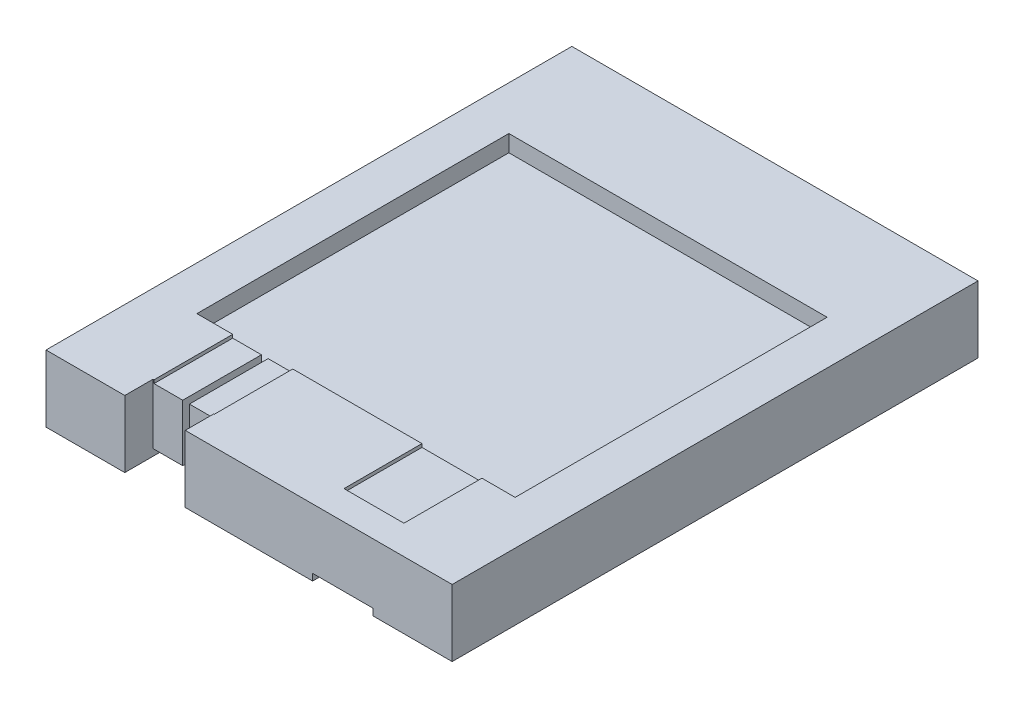
ISO-10303-21;
HEADER;
FILE_DESCRIPTION(('STEP AP214'),'2;1');
FILE_NAME('part.step','',(''),(''),'','','');
FILE_SCHEMA(('AUTOMOTIVE_DESIGN { 1 0 10303 214 1 1 1 1 }'));
ENDSEC;
DATA;
#1=APPLICATION_CONTEXT('core data for automotive mechanical design processes');
#2=APPLICATION_PROTOCOL_DEFINITION('international standard','automotive_design',2000,#1);
#3=PRODUCT_CONTEXT('',#1,'mechanical');
#4=PRODUCT('Part','Part','',(#3));
#5=PRODUCT_RELATED_PRODUCT_CATEGORY('part','',(#4));
#6=PRODUCT_DEFINITION_FORMATION('','',#4);
#7=PRODUCT_DEFINITION_CONTEXT('part definition',#1,'design');
#8=PRODUCT_DEFINITION('design','',#6,#7);
#9=PRODUCT_DEFINITION_SHAPE('','',#8);
#10=(LENGTH_UNIT() NAMED_UNIT(*) SI_UNIT(.MILLI.,.METRE.));
#11=(NAMED_UNIT(*) PLANE_ANGLE_UNIT() SI_UNIT($,.RADIAN.));
#12=(NAMED_UNIT(*) SI_UNIT($,.STERADIAN.) SOLID_ANGLE_UNIT());
#13=UNCERTAINTY_MEASURE_WITH_UNIT(LENGTH_MEASURE(1.E-05),#10,'distance_accuracy_value','');
#14=(GEOMETRIC_REPRESENTATION_CONTEXT(3) GLOBAL_UNCERTAINTY_ASSIGNED_CONTEXT((#13)) GLOBAL_UNIT_ASSIGNED_CONTEXT((#10,
#11,#12)) REPRESENTATION_CONTEXT('',''));
#15=CARTESIAN_POINT('',(0.,0.,0.));
#16=DIRECTION('',(0.,0.,1.));
#17=DIRECTION('',(1.,0.,0.));
#18=AXIS2_PLACEMENT_3D('',#15,#16,#17);
#19=CARTESIAN_POINT('',(0.,2.,0.));
#20=DIRECTION('',(0.,-1.,0.));
#21=DIRECTION('',(0.,0.,-1.));
#22=AXIS2_PLACEMENT_3D('',#19,#20,#21);
#23=PLANE('',#22);
#24=DIRECTION('',(0.,0.,1.));
#25=VECTOR('',#24,1.);
#26=CARTESIAN_POINT('',(-19.1136299810802,2.,78.7194338461538));
#27=LINE('',#26,#25);
#28=CARTESIAN_POINT('',(-19.1136299810801,2.,-78.7194338461538));
#29=VERTEX_POINT('',#28);
#30=CARTESIAN_POINT('',(-19.1136299810802,2.,70.266699865865));
#31=VERTEX_POINT('',#30);
#32=EDGE_CURVE('E374',#29,#31,#27,.T.);
#33=ORIENTED_EDGE('',*,*,#32,.T.);
#34=DIRECTION('',(-1.,0.,0.));
#35=VECTOR('',#34,1.);
#36=CARTESIAN_POINT('',(-19.1136299810802,2.,70.266699865865));
#37=LINE('',#36,#35);
#38=CARTESIAN_POINT('',(-26.3136299810801,2.,70.266699865865));
#39=VERTEX_POINT('',#38);
#40=EDGE_CURVE('E500',#31,#39,#37,.T.);
#41=ORIENTED_EDGE('',*,*,#40,.T.);
#42=DIRECTION('',(0.,0.,-1.));
#43=VECTOR('',#42,1.);
#44=CARTESIAN_POINT('',(-26.3136299810801,2.,0.));
#45=LINE('',#44,#43);
#46=CARTESIAN_POINT('',(-26.3136299810801,2.,46.7028180249685));
#47=VERTEX_POINT('',#46);
#48=EDGE_CURVE('E311',#39,#47,#45,.T.);
#49=ORIENTED_EDGE('',*,*,#48,.T.);
#50=DIRECTION('',(1.,0.,0.));
#51=VECTOR('',#50,1.);
#52=CARTESIAN_POINT('',(-28.3136299810801,2.,46.7028180249685));
#53=LINE('',#52,#51);
#54=CARTESIAN_POINT('',(-28.3136299810801,2.,46.7028180249685));
#55=VERTEX_POINT('',#54);
#56=EDGE_CURVE('E317',#55,#47,#53,.T.);
#57=ORIENTED_EDGE('',*,*,#56,.F.);
#58=DIRECTION('',(0.,0.,1.));
#59=VECTOR('',#58,1.);
#60=CARTESIAN_POINT('',(-28.3136299810801,2.,0.));
#61=LINE('',#60,#59);
#62=CARTESIAN_POINT('',(-28.3136299810801,2.,70.266699865865));
#63=VERTEX_POINT('',#62);
#64=EDGE_CURVE('E41',#55,#63,#61,.T.);
#65=ORIENTED_EDGE('',*,*,#64,.T.);
#66=CARTESIAN_POINT('',(-37.2136299810801,2.,70.266699865865));
#67=VERTEX_POINT('',#66);
#68=EDGE_CURVE('E48',#63,#67,#37,.T.);
#69=ORIENTED_EDGE('',*,*,#68,.T.);
#70=DIRECTION('',(0.,0.,-1.));
#71=VECTOR('',#70,1.);
#72=CARTESIAN_POINT('',(-37.2136299810801,2.,78.7194338461538));
#73=LINE('',#72,#71);
#74=CARTESIAN_POINT('',(-37.2136299810801,2.,-78.7194338461538));
#75=VERTEX_POINT('',#74);
#76=EDGE_CURVE('E369',#67,#75,#73,.T.);
#77=ORIENTED_EDGE('',*,*,#76,.T.);
#78=DIRECTION('',(1.,0.,0.));
#79=VECTOR('',#78,1.);
#80=CARTESIAN_POINT('',(-37.2136299810801,2.,-78.7194338461538));
#81=LINE('',#80,#79);
#82=EDGE_CURVE('E371',#75,#29,#81,.T.);
#83=ORIENTED_EDGE('',*,*,#82,.T.);
#84=EDGE_LOOP('',(#33,#41,#49,#57,#65,#69,#77,#83));
#85=FACE_BOUND('',#84,.T.);
#86=ADVANCED_FACE('F33',(#85),#23,.T.);
#87=CARTESIAN_POINT('',(-28.3136299810801,2.,79.7028180249685));
#88=DIRECTION('',(1.,0.,0.));
#89=DIRECTION('',(0.,0.,-1.));
#90=AXIS2_PLACEMENT_3D('',#87,#88,#89);
#91=PLANE('',#90);
#92=DIRECTION('',(0.,0.,-1.));
#93=VECTOR('',#92,1.);
#94=CARTESIAN_POINT('',(-28.3136299810801,19.,0.));
#95=LINE('',#94,#93);
#96=CARTESIAN_POINT('',(-28.3136299810801,19.,70.266699865865));
#97=VERTEX_POINT('',#96);
#98=CARTESIAN_POINT('',(-28.3136299810801,19.,46.7028180249685));
#99=VERTEX_POINT('',#98);
#100=EDGE_CURVE('E324',#97,#99,#95,.T.);
#101=ORIENTED_EDGE('',*,*,#100,.F.);
#102=DIRECTION('',(0.,-1.,0.));
#103=VECTOR('',#102,1.);
#104=CARTESIAN_POINT('',(-28.3136299810801,2.,70.266699865865));
#105=LINE('',#104,#103);
#106=EDGE_CURVE('E322',#97,#63,#105,.T.);
#107=ORIENTED_EDGE('',*,*,#106,.T.);
#108=ORIENTED_EDGE('',*,*,#64,.F.);
#109=DIRECTION('',(0.,-1.,0.));
#110=VECTOR('',#109,1.);
#111=CARTESIAN_POINT('',(-28.3136299810801,2.,46.7028180249685));
#112=LINE('',#111,#110);
#113=CARTESIAN_POINT('',(-28.3136299810801,15.,46.7028180249685));
#114=VERTEX_POINT('',#113);
#115=EDGE_CURVE('E56',#114,#55,#112,.T.);
#116=ORIENTED_EDGE('',*,*,#115,.F.);
#117=EDGE_CURVE('E328',#99,#114,#112,.T.);
#118=ORIENTED_EDGE('',*,*,#117,.F.);
#119=EDGE_LOOP('',(#101,#107,#108,#116,#118));
#120=FACE_BOUND('',#119,.T.);
#121=ADVANCED_FACE('F320',(#120),#91,.T.);
#122=CARTESIAN_POINT('',(-26.3136299810801,2.,79.7028180249685));
#123=DIRECTION('',(-1.,0.,0.));
#124=DIRECTION('',(0.,0.,1.));
#125=AXIS2_PLACEMENT_3D('',#122,#123,#124);
#126=PLANE('',#125);
#127=ORIENTED_EDGE('',*,*,#48,.F.);
#128=DIRECTION('',(0.,1.,0.));
#129=VECTOR('',#128,1.);
#130=CARTESIAN_POINT('',(-26.3136299810801,2.,70.266699865865));
#131=LINE('',#130,#129);
#132=CARTESIAN_POINT('',(-26.3136299810801,19.,70.266699865865));
#133=VERTEX_POINT('',#132);
#134=EDGE_CURVE('E11',#39,#133,#131,.T.);
#135=ORIENTED_EDGE('',*,*,#134,.T.);
#136=DIRECTION('',(0.,0.,1.));
#137=VECTOR('',#136,1.);
#138=CARTESIAN_POINT('',(-26.3136299810801,19.,0.));
#139=LINE('',#138,#137);
#140=CARTESIAN_POINT('',(-26.3136299810801,19.,46.7028180249685));
#141=VERTEX_POINT('',#140);
#142=EDGE_CURVE('E341',#141,#133,#139,.T.);
#143=ORIENTED_EDGE('',*,*,#142,.F.);
#144=DIRECTION('',(0.,1.,0.));
#145=VECTOR('',#144,1.);
#146=CARTESIAN_POINT('',(-26.3136299810801,2.,46.7028180249685));
#147=LINE('',#146,#145);
#148=CARTESIAN_POINT('',(-26.3136299810801,15.,46.7028180249685));
#149=VERTEX_POINT('',#148);
#150=EDGE_CURVE('E335',#149,#141,#147,.T.);
#151=ORIENTED_EDGE('',*,*,#150,.F.);
#152=EDGE_CURVE('E336',#47,#149,#147,.T.);
#153=ORIENTED_EDGE('',*,*,#152,.F.);
#154=EDGE_LOOP('',(#127,#135,#143,#151,#153));
#155=FACE_BOUND('',#154,.T.);
#156=ADVANCED_FACE('F533',(#155),#126,.T.);
#157=CARTESIAN_POINT('',(-60.8019507692308,20.,78.7194338461538));
#158=DIRECTION('',(0.,0.,-1.));
#159=DIRECTION('',(-1.,0.,0.));
#160=AXIS2_PLACEMENT_3D('',#157,#158,#159);
#161=PLANE('',#160);
#162=DIRECTION('',(0.,-1.,0.));
#163=VECTOR('',#162,1.);
#164=CARTESIAN_POINT('',(-37.2136299810801,2.,78.7194338461538));
#165=LINE('',#164,#163);
#166=CARTESIAN_POINT('',(-37.2136299810801,20.,78.7194338461538));
#167=VERTEX_POINT('',#166);
#168=CARTESIAN_POINT('',(-37.2136299810801,0.,78.7194338461538));
#169=VERTEX_POINT('',#168);
#170=EDGE_CURVE('E251',#167,#169,#165,.T.);
#171=ORIENTED_EDGE('',*,*,#170,.F.);
#172=DIRECTION('',(1.,0.,0.));
#173=VECTOR('',#172,1.);
#174=CARTESIAN_POINT('',(-60.8019507692308,20.,78.7194338461538));
#175=LINE('',#174,#173);
#176=CARTESIAN_POINT('',(-60.8019507692308,20.,78.7194338461538));
#177=VERTEX_POINT('',#176);
#178=EDGE_CURVE('E268',#177,#167,#175,.T.);
#179=ORIENTED_EDGE('',*,*,#178,.F.);
#180=DIRECTION('',(0.,-1.,0.));
#181=VECTOR('',#180,1.);
#182=CARTESIAN_POINT('',(-60.8019507692308,20.,78.7194338461538));
#183=LINE('',#182,#181);
#184=CARTESIAN_POINT('',(-60.8019507692308,0.,78.7194338461538));
#185=VERTEX_POINT('',#184);
#186=EDGE_CURVE('E293',#177,#185,#183,.T.);
#187=ORIENTED_EDGE('',*,*,#186,.T.);
#188=DIRECTION('',(1.,0.,0.));
#189=VECTOR('',#188,1.);
#190=CARTESIAN_POINT('',(-60.8019507692308,0.,78.7194338461538));
#191=LINE('',#190,#189);
#192=EDGE_CURVE('E287',#185,#169,#191,.T.);
#193=ORIENTED_EDGE('',*,*,#192,.T.);
#194=EDGE_LOOP('',(#171,#179,#187,#193));
#195=FACE_BOUND('',#194,.T.);
#196=ADVANCED_FACE('F488',(#195),#161,.F.);
#197=CARTESIAN_POINT('',(-19.1136299810802,20.,78.7194338461538));
#198=VERTEX_POINT('',#197);
#199=CARTESIAN_POINT('',(60.8019507692308,20.,78.7194338461538));
#200=VERTEX_POINT('',#199);
#201=EDGE_CURVE('E258',#198,#200,#175,.T.);
#202=ORIENTED_EDGE('',*,*,#201,.F.);
#203=DIRECTION('',(0.,-1.,0.));
#204=VECTOR('',#203,1.);
#205=CARTESIAN_POINT('',(-19.1136299810802,2.,78.7194338461538));
#206=LINE('',#205,#204);
#207=CARTESIAN_POINT('',(-19.1136299810802,0.,78.7194338461538));
#208=VERTEX_POINT('',#207);
#209=EDGE_CURVE('E239',#198,#208,#206,.T.);
#210=ORIENTED_EDGE('',*,*,#209,.T.);
#211=CARTESIAN_POINT('',(19.030400305009,0.,78.7194338461538));
#212=VERTEX_POINT('',#211);
#213=EDGE_CURVE('E291',#208,#212,#191,.T.);
#214=ORIENTED_EDGE('',*,*,#213,.T.);
#215=DIRECTION('',(0.,1.,0.));
#216=VECTOR('',#215,1.);
#217=CARTESIAN_POINT('',(19.030400305009,20.,78.7194338461538));
#218=LINE('',#217,#216);
#219=CARTESIAN_POINT('',(19.030400305009,2.,78.7194338461538));
#220=VERTEX_POINT('',#219);
#221=EDGE_CURVE('E365',#212,#220,#218,.T.);
#222=ORIENTED_EDGE('',*,*,#221,.T.);
#223=DIRECTION('',(-1.,0.,0.));
#224=VECTOR('',#223,1.);
#225=CARTESIAN_POINT('',(-60.8019507692308,2.,78.7194338461538));
#226=LINE('',#225,#224);
#227=CARTESIAN_POINT('',(37.130400305009,2.,78.7194338461538));
#228=VERTEX_POINT('',#227);
#229=EDGE_CURVE('E309',#228,#220,#226,.T.);
#230=ORIENTED_EDGE('',*,*,#229,.F.);
#231=DIRECTION('',(0.,-1.,0.));
#232=VECTOR('',#231,1.);
#233=CARTESIAN_POINT('',(37.130400305009,20.,78.7194338461538));
#234=LINE('',#233,#232);
#235=CARTESIAN_POINT('',(37.130400305009,0.,78.7194338461538));
#236=VERTEX_POINT('',#235);
#237=EDGE_CURVE('E361',#228,#236,#234,.T.);
#238=ORIENTED_EDGE('',*,*,#237,.T.);
#239=CARTESIAN_POINT('',(60.8019507692308,0.,78.7194338461538));
#240=VERTEX_POINT('',#239);
#241=EDGE_CURVE('E286',#236,#240,#191,.T.);
#242=ORIENTED_EDGE('',*,*,#241,.T.);
#243=DIRECTION('',(0.,-1.,0.));
#244=VECTOR('',#243,1.);
#245=CARTESIAN_POINT('',(60.8019507692308,20.,78.7194338461538));
#246=LINE('',#245,#244);
#247=EDGE_CURVE('E266',#200,#240,#246,.T.);
#248=ORIENTED_EDGE('',*,*,#247,.F.);
#249=EDGE_LOOP('',(#202,#210,#214,#222,#230,#238,#242,#248));
#250=FACE_BOUND('',#249,.T.);
#251=ADVANCED_FACE('F264',(#250),#161,.F.);
#252=CARTESIAN_POINT('',(0.,20.,0.));
#253=DIRECTION('',(0.,-1.,0.));
#254=DIRECTION('',(0.,0.,-1.));
#255=AXIS2_PLACEMENT_3D('',#252,#253,#254);
#256=PLANE('',#255);
#257=DIRECTION('',(1.,0.,0.));
#258=VECTOR('',#257,1.);
#259=CARTESIAN_POINT('',(-18.9363839661472,20.,70.266699865865));
#260=LINE('',#259,#258);
#261=CARTESIAN_POINT('',(-19.1136299810802,20.,70.266699865865));
#262=VERTEX_POINT('',#261);
#263=CARTESIAN_POINT('',(-18.9363839661472,20.,70.266699865865));
#264=VERTEX_POINT('',#263);
#265=EDGE_CURVE('E261',#262,#264,#260,.T.);
#266=ORIENTED_EDGE('',*,*,#265,.F.);
#267=DIRECTION('',(0.,0.,1.));
#268=VECTOR('',#267,1.);
#269=CARTESIAN_POINT('',(-19.1136299810802,20.,44.7400471279912));
#270=LINE('',#269,#268);
#271=EDGE_CURVE('E243',#262,#198,#270,.T.);
#272=ORIENTED_EDGE('',*,*,#271,.T.);
#273=ORIENTED_EDGE('',*,*,#201,.T.);
#274=DIRECTION('',(0.,0.,-1.));
#275=VECTOR('',#274,1.);
#276=CARTESIAN_POINT('',(60.8019507692308,20.,78.7194338461538));
#277=LINE('',#276,#275);
#278=CARTESIAN_POINT('',(60.8019507692308,20.,-78.7194338461538));
#279=VERTEX_POINT('',#278);
#280=EDGE_CURVE('E290',#200,#279,#277,.T.);
#281=ORIENTED_EDGE('',*,*,#280,.T.);
#282=DIRECTION('',(-1.,0.,0.));
#283=VECTOR('',#282,1.);
#284=CARTESIAN_POINT('',(-60.8019507692308,20.,-78.7194338461538));
#285=LINE('',#284,#283);
#286=CARTESIAN_POINT('',(-60.8019507692308,20.,-78.7194338461538));
#287=VERTEX_POINT('',#286);
#288=EDGE_CURVE('E272',#279,#287,#285,.T.);
#289=ORIENTED_EDGE('',*,*,#288,.T.);
#290=DIRECTION('',(0.,0.,1.));
#291=VECTOR('',#290,1.);
#292=CARTESIAN_POINT('',(-60.8019507692308,20.,78.7194338461538));
#293=LINE('',#292,#291);
#294=EDGE_CURVE('E269',#287,#177,#293,.T.);
#295=ORIENTED_EDGE('',*,*,#294,.T.);
#296=ORIENTED_EDGE('',*,*,#178,.T.);
#297=DIRECTION('',(0.,0.,1.));
#298=VECTOR('',#297,1.);
#299=CARTESIAN_POINT('',(-37.2136299810801,20.,44.7400471279912));
#300=LINE('',#299,#298);
#301=CARTESIAN_POINT('',(-37.2136299810801,20.,70.266699865865));
#302=VERTEX_POINT('',#301);
#303=EDGE_CURVE('E262',#302,#167,#300,.T.);
#304=ORIENTED_EDGE('',*,*,#303,.F.);
#305=DIRECTION('',(1.,0.,0.));
#306=VECTOR('',#305,1.);
#307=CARTESIAN_POINT('',(-19.1136299810802,20.,70.266699865865));
#308=LINE('',#307,#306);
#309=CARTESIAN_POINT('',(-36.9121512462795,20.,70.266699865865));
#310=VERTEX_POINT('',#309);
#311=EDGE_CURVE('E326',#302,#310,#308,.T.);
#312=ORIENTED_EDGE('',*,*,#311,.T.);
#313=DIRECTION('',(0.,0.,1.));
#314=VECTOR('',#313,1.);
#315=CARTESIAN_POINT('',(-36.9121512462795,20.,70.266699865865));
#316=LINE('',#315,#314);
#317=CARTESIAN_POINT('',(-36.9121512462795,20.,46.7028180249685));
#318=VERTEX_POINT('',#317);
#319=EDGE_CURVE('E432',#318,#310,#316,.T.);
#320=ORIENTED_EDGE('',*,*,#319,.F.);
#321=DIRECTION('',(1.,0.,0.));
#322=VECTOR('',#321,1.);
#323=CARTESIAN_POINT('',(-47.6429014089363,20.,46.7028180249685));
#324=LINE('',#323,#322);
#325=CARTESIAN_POINT('',(-47.6429014089363,20.,46.7028180249685));
#326=VERTEX_POINT('',#325);
#327=EDGE_CURVE('E388',#326,#318,#324,.T.);
#328=ORIENTED_EDGE('',*,*,#327,.F.);
#329=DIRECTION('',(0.,0.,1.));
#330=VECTOR('',#329,1.);
#331=CARTESIAN_POINT('',(-47.6429014089363,20.,-46.7028180249685));
#332=LINE('',#331,#330);
#333=CARTESIAN_POINT('',(-47.6429014089363,20.,-46.7028180249685));
#334=VERTEX_POINT('',#333);
#335=EDGE_CURVE('E404',#334,#326,#332,.T.);
#336=ORIENTED_EDGE('',*,*,#335,.F.);
#337=DIRECTION('',(-1.,0.,0.));
#338=VECTOR('',#337,1.);
#339=CARTESIAN_POINT('',(-47.6429014089363,20.,-46.7028180249685));
#340=LINE('',#339,#338);
#341=CARTESIAN_POINT('',(47.6429014089363,20.,-46.7028180249685));
#342=VERTEX_POINT('',#341);
#343=EDGE_CURVE('E401',#342,#334,#340,.T.);
#344=ORIENTED_EDGE('',*,*,#343,.F.);
#345=DIRECTION('',(0.,0.,-1.));
#346=VECTOR('',#345,1.);
#347=CARTESIAN_POINT('',(47.6429014089363,20.,-46.7028180249685));
#348=LINE('',#347,#346);
#349=CARTESIAN_POINT('',(47.6429014089363,20.,46.7028180249685));
#350=VERTEX_POINT('',#349);
#351=EDGE_CURVE('E379',#350,#342,#348,.T.);
#352=ORIENTED_EDGE('',*,*,#351,.F.);
#353=CARTESIAN_POINT('',(37.697761268388,20.,46.7028180249685));
#354=VERTEX_POINT('',#353);
#355=EDGE_CURVE('E407',#354,#350,#324,.T.);
#356=ORIENTED_EDGE('',*,*,#355,.F.);
#357=DIRECTION('',(0.,0.,-1.));
#358=VECTOR('',#357,1.);
#359=CARTESIAN_POINT('',(37.697761268388,20.,70.0512109111461));
#360=LINE('',#359,#358);
#361=CARTESIAN_POINT('',(37.697761268388,20.,70.0512109111461));
#362=VERTEX_POINT('',#361);
#363=EDGE_CURVE('E458',#362,#354,#360,.T.);
#364=ORIENTED_EDGE('',*,*,#363,.F.);
#365=DIRECTION('',(1.,0.,0.));
#366=VECTOR('',#365,1.);
#367=CARTESIAN_POINT('',(37.697761268388,20.,70.0512109111461));
#368=LINE('',#367,#366);
#369=CARTESIAN_POINT('',(19.7464463786794,20.,70.0512109111461));
#370=VERTEX_POINT('',#369);
#371=EDGE_CURVE('E466',#370,#362,#368,.T.);
#372=ORIENTED_EDGE('',*,*,#371,.F.);
#373=DIRECTION('',(0.,0.,1.));
#374=VECTOR('',#373,1.);
#375=CARTESIAN_POINT('',(19.7464463786794,20.,70.0512109111461));
#376=LINE('',#375,#374);
#377=CARTESIAN_POINT('',(19.7464463786794,20.,46.7028180249685));
#378=VERTEX_POINT('',#377);
#379=EDGE_CURVE('E453',#378,#370,#376,.T.);
#380=ORIENTED_EDGE('',*,*,#379,.F.);
#381=CARTESIAN_POINT('',(-18.9363839661472,20.,46.7028180249685));
#382=VERTEX_POINT('',#381);
#383=EDGE_CURVE('E409',#382,#378,#324,.T.);
#384=ORIENTED_EDGE('',*,*,#383,.F.);
#385=DIRECTION('',(0.,0.,-1.));
#386=VECTOR('',#385,1.);
#387=CARTESIAN_POINT('',(-18.9363839661472,20.,70.266699865865));
#388=LINE('',#387,#386);
#389=EDGE_CURVE('E437',#264,#382,#388,.T.);
#390=ORIENTED_EDGE('',*,*,#389,.F.);
#391=EDGE_LOOP('',(#266,#272,#273,#281,#289,#295,#296,#304,#312,#320,#328,#336,#344,#352,#356,
#364,#372,#380,#384,#390));
#392=FACE_BOUND('',#391,.T.);
#393=ADVANCED_FACE('F256',(#392),#256,.F.);
#394=CARTESIAN_POINT('',(-18.9363839661472,19.,70.266699865865));
#395=DIRECTION('',(0.,0.,1.));
#396=DIRECTION('',(1.,0.,0.));
#397=AXIS2_PLACEMENT_3D('',#394,#395,#396);
#398=PLANE('',#397);
#399=DIRECTION('',(1.,0.,0.));
#400=VECTOR('',#399,1.);
#401=CARTESIAN_POINT('',(-18.9363839661472,19.,70.266699865865));
#402=LINE('',#401,#400);
#403=CARTESIAN_POINT('',(-19.1136299810802,19.,70.266699865865));
#404=VERTEX_POINT('',#403);
#405=CARTESIAN_POINT('',(-18.9363839661472,19.,70.266699865865));
#406=VERTEX_POINT('',#405);
#407=EDGE_CURVE('E436',#404,#406,#402,.T.);
#408=ORIENTED_EDGE('',*,*,#407,.F.);
#409=DIRECTION('',(0.,-1.,0.));
#410=VECTOR('',#409,1.);
#411=CARTESIAN_POINT('',(-19.1136299810802,2.,70.266699865865));
#412=LINE('',#411,#410);
#413=EDGE_CURVE('E331',#262,#404,#412,.T.);
#414=ORIENTED_EDGE('',*,*,#413,.F.);
#415=ORIENTED_EDGE('',*,*,#265,.T.);
#416=DIRECTION('',(0.,1.,0.));
#417=VECTOR('',#416,1.);
#418=CARTESIAN_POINT('',(-18.9363839661472,19.,70.266699865865));
#419=LINE('',#418,#417);
#420=EDGE_CURVE('E450',#406,#264,#419,.T.);
#421=ORIENTED_EDGE('',*,*,#420,.F.);
#422=EDGE_LOOP('',(#408,#414,#415,#421));
#423=FACE_BOUND('',#422,.T.);
#424=ADVANCED_FACE('F570',(#423),#398,.F.);
#425=CARTESIAN_POINT('',(0.,19.,0.));
#426=DIRECTION('',(0.,1.,0.));
#427=DIRECTION('',(0.,0.,1.));
#428=AXIS2_PLACEMENT_3D('',#425,#426,#427);
#429=PLANE('',#428);
#430=CARTESIAN_POINT('',(-36.9121512462795,19.,70.266699865865));
#431=VERTEX_POINT('',#430);
#432=EDGE_CURVE('E438',#431,#97,#402,.T.);
#433=ORIENTED_EDGE('',*,*,#432,.T.);
#434=ORIENTED_EDGE('',*,*,#100,.T.);
#435=DIRECTION('',(1.,0.,0.));
#436=VECTOR('',#435,1.);
#437=CARTESIAN_POINT('',(0.,19.,46.7028180249685));
#438=LINE('',#437,#436);
#439=CARTESIAN_POINT('',(-36.9121512462795,19.,46.7028180249685));
#440=VERTEX_POINT('',#439);
#441=EDGE_CURVE('E303',#440,#99,#438,.T.);
#442=ORIENTED_EDGE('',*,*,#441,.F.);
#443=DIRECTION('',(0.,0.,1.));
#444=VECTOR('',#443,1.);
#445=CARTESIAN_POINT('',(-36.9121512462795,19.,70.266699865865));
#446=LINE('',#445,#444);
#447=EDGE_CURVE('E433',#440,#431,#446,.T.);
#448=ORIENTED_EDGE('',*,*,#447,.T.);
#449=EDGE_LOOP('',(#433,#434,#442,#448));
#450=FACE_BOUND('',#449,.T.);
#451=ADVANCED_FACE('F567',(#450),#429,.T.);
#452=CARTESIAN_POINT('',(-18.9363839661472,19.,46.7028180249685));
#453=VERTEX_POINT('',#452);
#454=EDGE_CURVE('E302',#141,#453,#438,.T.);
#455=ORIENTED_EDGE('',*,*,#454,.F.);
#456=ORIENTED_EDGE('',*,*,#142,.T.);
#457=EDGE_CURVE('E441',#133,#404,#402,.T.);
#458=ORIENTED_EDGE('',*,*,#457,.T.);
#459=ORIENTED_EDGE('',*,*,#407,.T.);
#460=DIRECTION('',(0.,0.,-1.));
#461=VECTOR('',#460,1.);
#462=CARTESIAN_POINT('',(-18.9363839661472,19.,70.266699865865));
#463=LINE('',#462,#461);
#464=EDGE_CURVE('E440',#406,#453,#463,.T.);
#465=ORIENTED_EDGE('',*,*,#464,.T.);
#466=EDGE_LOOP('',(#455,#456,#458,#459,#465));
#467=FACE_BOUND('',#466,.T.);
#468=ADVANCED_FACE('F553',(#467),#429,.T.);
#469=CARTESIAN_POINT('',(-47.6429014089363,15.,46.7028180249685));
#470=DIRECTION('',(0.,0.,1.));
#471=DIRECTION('',(1.,0.,0.));
#472=AXIS2_PLACEMENT_3D('',#469,#470,#471);
#473=PLANE('',#472);
#474=ORIENTED_EDGE('',*,*,#117,.T.);
#475=DIRECTION('',(1.,0.,0.));
#476=VECTOR('',#475,1.);
#477=CARTESIAN_POINT('',(-47.6429014089363,15.,46.7028180249685));
#478=LINE('',#477,#476);
#479=CARTESIAN_POINT('',(-47.6429014089363,15.,46.7028180249685));
#480=VERTEX_POINT('',#479);
#481=EDGE_CURVE('E395',#480,#114,#478,.T.);
#482=ORIENTED_EDGE('',*,*,#481,.F.);
#483=DIRECTION('',(0.,1.,0.));
#484=VECTOR('',#483,1.);
#485=CARTESIAN_POINT('',(-47.6429014089363,15.,46.7028180249685));
#486=LINE('',#485,#484);
#487=EDGE_CURVE('E414',#480,#326,#486,.T.);
#488=ORIENTED_EDGE('',*,*,#487,.T.);
#489=ORIENTED_EDGE('',*,*,#327,.T.);
#490=DIRECTION('',(0.,1.,0.));
#491=VECTOR('',#490,1.);
#492=CARTESIAN_POINT('',(-36.9121512462795,19.,46.7028180249685));
#493=LINE('',#492,#491);
#494=EDGE_CURVE('E421',#440,#318,#493,.T.);
#495=ORIENTED_EDGE('',*,*,#494,.F.);
#496=ORIENTED_EDGE('',*,*,#441,.T.);
#497=EDGE_LOOP('',(#474,#482,#488,#489,#495,#496));
#498=FACE_BOUND('',#497,.T.);
#499=ADVANCED_FACE('F550',(#498),#473,.F.);
#500=ORIENTED_EDGE('',*,*,#150,.T.);
#501=ORIENTED_EDGE('',*,*,#454,.T.);
#502=DIRECTION('',(0.,-1.,0.));
#503=VECTOR('',#502,1.);
#504=CARTESIAN_POINT('',(-18.9363839661472,19.,46.7028180249685));
#505=LINE('',#504,#503);
#506=EDGE_CURVE('E413',#382,#453,#505,.T.);
#507=ORIENTED_EDGE('',*,*,#506,.F.);
#508=ORIENTED_EDGE('',*,*,#383,.T.);
#509=DIRECTION('',(0.,1.,0.));
#510=VECTOR('',#509,1.);
#511=CARTESIAN_POINT('',(19.7464463786794,19.,46.7028180249685));
#512=LINE('',#511,#510);
#513=CARTESIAN_POINT('',(19.7464463786794,19.,46.7028180249685));
#514=VERTEX_POINT('',#513);
#515=EDGE_CURVE('E429',#514,#378,#512,.T.);
#516=ORIENTED_EDGE('',*,*,#515,.F.);
#517=DIRECTION('',(1.,0.,0.));
#518=VECTOR('',#517,1.);
#519=CARTESIAN_POINT('',(0.,19.,46.7028180249685));
#520=LINE('',#519,#518);
#521=CARTESIAN_POINT('',(37.697761268388,19.,46.7028180249685));
#522=VERTEX_POINT('',#521);
#523=EDGE_CURVE('E424',#514,#522,#520,.T.);
#524=ORIENTED_EDGE('',*,*,#523,.T.);
#525=DIRECTION('',(0.,-1.,0.));
#526=VECTOR('',#525,1.);
#527=CARTESIAN_POINT('',(37.697761268388,19.,46.7028180249685));
#528=LINE('',#527,#526);
#529=EDGE_CURVE('E426',#354,#522,#528,.T.);
#530=ORIENTED_EDGE('',*,*,#529,.F.);
#531=ORIENTED_EDGE('',*,*,#355,.T.);
#532=DIRECTION('',(0.,1.,0.));
#533=VECTOR('',#532,1.);
#534=CARTESIAN_POINT('',(47.6429014089363,15.,46.7028180249685));
#535=LINE('',#534,#533);
#536=CARTESIAN_POINT('',(47.6429014089363,15.,46.7028180249685));
#537=VERTEX_POINT('',#536);
#538=EDGE_CURVE('E410',#537,#350,#535,.T.);
#539=ORIENTED_EDGE('',*,*,#538,.F.);
#540=EDGE_CURVE('E394',#149,#537,#478,.T.);
#541=ORIENTED_EDGE('',*,*,#540,.F.);
#542=EDGE_LOOP('',(#500,#501,#507,#508,#516,#524,#530,#531,#539,#541));
#543=FACE_BOUND('',#542,.T.);
#544=ADVANCED_FACE('F524',(#543),#473,.F.);
#545=CARTESIAN_POINT('',(0.,0.,0.));
#546=DIRECTION('',(0.,-1.,0.));
#547=DIRECTION('',(0.,0.,-1.));
#548=AXIS2_PLACEMENT_3D('',#545,#546,#547);
#549=PLANE('',#548);
#550=DIRECTION('',(0.,0.,-1.));
#551=VECTOR('',#550,1.);
#552=CARTESIAN_POINT('',(-37.2136299810801,0.,78.7194338461538));
#553=LINE('',#552,#551);
#554=CARTESIAN_POINT('',(-37.2136299810801,0.,-78.7194338461538));
#555=VERTEX_POINT('',#554);
#556=EDGE_CURVE('E368',#169,#555,#553,.T.);
#557=ORIENTED_EDGE('',*,*,#556,.F.);
#558=ORIENTED_EDGE('',*,*,#192,.F.);
#559=DIRECTION('',(0.,0.,1.));
#560=VECTOR('',#559,1.);
#561=CARTESIAN_POINT('',(-60.8019507692308,0.,78.7194338461538));
#562=LINE('',#561,#560);
#563=CARTESIAN_POINT('',(-60.8019507692308,0.,-78.7194338461538));
#564=VERTEX_POINT('',#563);
#565=EDGE_CURVE('E284',#564,#185,#562,.T.);
#566=ORIENTED_EDGE('',*,*,#565,.F.);
#567=DIRECTION('',(-1.,0.,0.));
#568=VECTOR('',#567,1.);
#569=CARTESIAN_POINT('',(-60.8019507692308,0.,-78.7194338461538));
#570=LINE('',#569,#568);
#571=EDGE_CURVE('E279',#555,#564,#570,.T.);
#572=ORIENTED_EDGE('',*,*,#571,.F.);
#573=EDGE_LOOP('',(#557,#558,#566,#572));
#574=FACE_BOUND('',#573,.T.);
#575=ADVANCED_FACE('F519',(#574),#549,.T.);
#576=CARTESIAN_POINT('',(60.8019507692308,20.,78.7194338461538));
#577=DIRECTION('',(-1.,0.,0.));
#578=DIRECTION('',(0.,0.,1.));
#579=AXIS2_PLACEMENT_3D('',#576,#577,#578);
#580=PLANE('',#579);
#581=DIRECTION('',(0.,0.,-1.));
#582=VECTOR('',#581,1.);
#583=CARTESIAN_POINT('',(60.8019507692308,0.,78.7194338461538));
#584=LINE('',#583,#582);
#585=CARTESIAN_POINT('',(60.8019507692308,0.,-78.7194338461538));
#586=VERTEX_POINT('',#585);
#587=EDGE_CURVE('E276',#240,#586,#584,.T.);
#588=ORIENTED_EDGE('',*,*,#587,.T.);
#589=DIRECTION('',(0.,-1.,0.));
#590=VECTOR('',#589,1.);
#591=CARTESIAN_POINT('',(60.8019507692308,20.,-78.7194338461538));
#592=LINE('',#591,#590);
#593=EDGE_CURVE('E299',#279,#586,#592,.T.);
#594=ORIENTED_EDGE('',*,*,#593,.F.);
#595=ORIENTED_EDGE('',*,*,#280,.F.);
#596=ORIENTED_EDGE('',*,*,#247,.T.);
#597=EDGE_LOOP('',(#588,#594,#595,#596));
#598=FACE_BOUND('',#597,.T.);
#599=ADVANCED_FACE('F35',(#598),#580,.F.);
#600=CARTESIAN_POINT('',(-60.8019507692308,20.,-78.7194338461538));
#601=DIRECTION('',(0.,0.,1.));
#602=DIRECTION('',(1.,0.,0.));
#603=AXIS2_PLACEMENT_3D('',#600,#601,#602);
#604=PLANE('',#603);
#605=ORIENTED_EDGE('',*,*,#82,.F.);
#606=DIRECTION('',(0.,-1.,0.));
#607=VECTOR('',#606,1.);
#608=CARTESIAN_POINT('',(-37.2136299810801,2.,-78.7194338461538));
#609=LINE('',#608,#607);
#610=EDGE_CURVE('E376',#75,#555,#609,.T.);
#611=ORIENTED_EDGE('',*,*,#610,.T.);
#612=ORIENTED_EDGE('',*,*,#571,.T.);
#613=DIRECTION('',(0.,-1.,0.));
#614=VECTOR('',#613,1.);
#615=CARTESIAN_POINT('',(-60.8019507692308,20.,-78.7194338461538));
#616=LINE('',#615,#614);
#617=EDGE_CURVE('E296',#287,#564,#616,.T.);
#618=ORIENTED_EDGE('',*,*,#617,.F.);
#619=ORIENTED_EDGE('',*,*,#288,.F.);
#620=ORIENTED_EDGE('',*,*,#593,.T.);
#621=CARTESIAN_POINT('',(-19.1136299810802,0.,-78.7194338461538));
#622=VERTEX_POINT('',#621);
#623=EDGE_CURVE('E281',#586,#622,#570,.T.);
#624=ORIENTED_EDGE('',*,*,#623,.T.);
#625=DIRECTION('',(0.,-1.,0.));
#626=VECTOR('',#625,1.);
#627=CARTESIAN_POINT('',(-19.1136299810801,2.,-78.7194338461538));
#628=LINE('',#627,#626);
#629=EDGE_CURVE('E252',#29,#622,#628,.T.);
#630=ORIENTED_EDGE('',*,*,#629,.F.);
#631=EDGE_LOOP('',(#605,#611,#612,#618,#619,#620,#624,#630));
#632=FACE_BOUND('',#631,.T.);
#633=ADVANCED_FACE('F480',(#632),#604,.F.);
#634=CARTESIAN_POINT('',(-60.8019507692308,20.,78.7194338461538));
#635=DIRECTION('',(1.,0.,0.));
#636=DIRECTION('',(0.,0.,-1.));
#637=AXIS2_PLACEMENT_3D('',#634,#635,#636);
#638=PLANE('',#637);
#639=ORIENTED_EDGE('',*,*,#565,.T.);
#640=ORIENTED_EDGE('',*,*,#186,.F.);
#641=ORIENTED_EDGE('',*,*,#294,.F.);
#642=ORIENTED_EDGE('',*,*,#617,.T.);
#643=EDGE_LOOP('',(#639,#640,#641,#642));
#644=FACE_BOUND('',#643,.T.);
#645=ADVANCED_FACE('F484',(#644),#638,.F.);
#646=DIRECTION('',(0.,0.,-1.));
#647=VECTOR('',#646,1.);
#648=CARTESIAN_POINT('',(19.030400305009,0.,0.));
#649=LINE('',#648,#647);
#650=CARTESIAN_POINT('',(19.030400305009,0.,-78.5827032041025));
#651=VERTEX_POINT('',#650);
#652=EDGE_CURVE('E306',#212,#651,#649,.T.);
#653=ORIENTED_EDGE('',*,*,#652,.F.);
#654=ORIENTED_EDGE('',*,*,#213,.F.);
#655=DIRECTION('',(0.,0.,1.));
#656=VECTOR('',#655,1.);
#657=CARTESIAN_POINT('',(-19.1136299810802,0.,78.7194338461538));
#658=LINE('',#657,#656);
#659=EDGE_CURVE('E246',#622,#208,#658,.T.);
#660=ORIENTED_EDGE('',*,*,#659,.F.);
#661=ORIENTED_EDGE('',*,*,#623,.F.);
#662=ORIENTED_EDGE('',*,*,#587,.F.);
#663=ORIENTED_EDGE('',*,*,#241,.F.);
#664=DIRECTION('',(0.,0.,1.));
#665=VECTOR('',#664,1.);
#666=CARTESIAN_POINT('',(37.130400305009,0.,78.8561644882052));
#667=LINE('',#666,#665);
#668=CARTESIAN_POINT('',(37.130400305009,0.,-78.5827032041025));
#669=VERTEX_POINT('',#668);
#670=EDGE_CURVE('E349',#669,#236,#667,.T.);
#671=ORIENTED_EDGE('',*,*,#670,.F.);
#672=DIRECTION('',(1.,0.,0.));
#673=VECTOR('',#672,1.);
#674=CARTESIAN_POINT('',(19.030400305009,0.,-78.5827032041025));
#675=LINE('',#674,#673);
#676=EDGE_CURVE('E345',#651,#669,#675,.T.);
#677=ORIENTED_EDGE('',*,*,#676,.F.);
#678=EDGE_LOOP('',(#653,#654,#660,#661,#662,#663,#671,#677));
#679=FACE_BOUND('',#678,.T.);
#680=ADVANCED_FACE('F511',(#679),#549,.T.);
#681=CARTESIAN_POINT('',(19.7464463786794,19.,70.0512109111461));
#682=DIRECTION('',(-1.,0.,0.));
#683=DIRECTION('',(0.,0.,1.));
#684=AXIS2_PLACEMENT_3D('',#681,#682,#683);
#685=PLANE('',#684);
#686=DIRECTION('',(0.,0.,1.));
#687=VECTOR('',#686,1.);
#688=CARTESIAN_POINT('',(19.7464463786794,19.,70.0512109111461));
#689=LINE('',#688,#687);
#690=CARTESIAN_POINT('',(19.7464463786794,19.,70.0512109111461));
#691=VERTEX_POINT('',#690);
#692=EDGE_CURVE('E455',#514,#691,#689,.T.);
#693=ORIENTED_EDGE('',*,*,#692,.F.);
#694=ORIENTED_EDGE('',*,*,#515,.T.);
#695=ORIENTED_EDGE('',*,*,#379,.T.);
#696=DIRECTION('',(0.,1.,0.));
#697=VECTOR('',#696,1.);
#698=CARTESIAN_POINT('',(19.7464463786794,19.,70.0512109111461));
#699=LINE('',#698,#697);
#700=EDGE_CURVE('E464',#691,#370,#699,.T.);
#701=ORIENTED_EDGE('',*,*,#700,.F.);
#702=EDGE_LOOP('',(#693,#694,#695,#701));
#703=FACE_BOUND('',#702,.T.);
#704=ADVANCED_FACE('F590',(#703),#685,.F.);
#705=CARTESIAN_POINT('',(37.697761268388,19.,70.0512109111461));
#706=DIRECTION('',(1.,0.,0.));
#707=DIRECTION('',(0.,0.,-1.));
#708=AXIS2_PLACEMENT_3D('',#705,#706,#707);
#709=PLANE('',#708);
#710=ORIENTED_EDGE('',*,*,#363,.T.);
#711=ORIENTED_EDGE('',*,*,#529,.T.);
#712=DIRECTION('',(0.,0.,-1.));
#713=VECTOR('',#712,1.);
#714=CARTESIAN_POINT('',(37.697761268388,19.,70.0512109111461));
#715=LINE('',#714,#713);
#716=CARTESIAN_POINT('',(37.697761268388,19.,70.0512109111461));
#717=VERTEX_POINT('',#716);
#718=EDGE_CURVE('E461',#717,#522,#715,.T.);
#719=ORIENTED_EDGE('',*,*,#718,.F.);
#720=DIRECTION('',(0.,1.,0.));
#721=VECTOR('',#720,1.);
#722=CARTESIAN_POINT('',(37.697761268388,19.,70.0512109111461));
#723=LINE('',#722,#721);
#724=EDGE_CURVE('E280',#717,#362,#723,.T.);
#725=ORIENTED_EDGE('',*,*,#724,.T.);
#726=EDGE_LOOP('',(#710,#711,#719,#725));
#727=FACE_BOUND('',#726,.T.);
#728=ADVANCED_FACE('F587',(#727),#709,.F.);
#729=CARTESIAN_POINT('',(37.697761268388,19.,70.0512109111461));
#730=DIRECTION('',(0.,0.,1.));
#731=DIRECTION('',(1.,0.,0.));
#732=AXIS2_PLACEMENT_3D('',#729,#730,#731);
#733=PLANE('',#732);
#734=ORIENTED_EDGE('',*,*,#371,.T.);
#735=ORIENTED_EDGE('',*,*,#724,.F.);
#736=DIRECTION('',(1.,0.,0.));
#737=VECTOR('',#736,1.);
#738=CARTESIAN_POINT('',(37.697761268388,19.,70.0512109111461));
#739=LINE('',#738,#737);
#740=EDGE_CURVE('E457',#691,#717,#739,.T.);
#741=ORIENTED_EDGE('',*,*,#740,.F.);
#742=ORIENTED_EDGE('',*,*,#700,.T.);
#743=EDGE_LOOP('',(#734,#735,#741,#742));
#744=FACE_BOUND('',#743,.T.);
#745=ADVANCED_FACE('F585',(#744),#733,.F.);
#746=CARTESIAN_POINT('',(0.,19.,0.));
#747=DIRECTION('',(0.,1.,0.));
#748=DIRECTION('',(0.,0.,1.));
#749=AXIS2_PLACEMENT_3D('',#746,#747,#748);
#750=PLANE('',#749);
#751=ORIENTED_EDGE('',*,*,#523,.F.);
#752=ORIENTED_EDGE('',*,*,#692,.T.);
#753=ORIENTED_EDGE('',*,*,#740,.T.);
#754=ORIENTED_EDGE('',*,*,#718,.T.);
#755=EDGE_LOOP('',(#751,#752,#753,#754));
#756=FACE_BOUND('',#755,.T.);
#757=ADVANCED_FACE('F581',(#756),#750,.T.);
#758=CARTESIAN_POINT('',(-36.9121512462795,19.,70.266699865865));
#759=DIRECTION('',(-1.,0.,0.));
#760=DIRECTION('',(0.,0.,1.));
#761=AXIS2_PLACEMENT_3D('',#758,#759,#760);
#762=PLANE('',#761);
#763=ORIENTED_EDGE('',*,*,#447,.F.);
#764=ORIENTED_EDGE('',*,*,#494,.T.);
#765=ORIENTED_EDGE('',*,*,#319,.T.);
#766=DIRECTION('',(0.,1.,0.));
#767=VECTOR('',#766,1.);
#768=CARTESIAN_POINT('',(-36.9121512462795,19.,70.266699865865));
#769=LINE('',#768,#767);
#770=EDGE_CURVE('E444',#431,#310,#769,.T.);
#771=ORIENTED_EDGE('',*,*,#770,.F.);
#772=EDGE_LOOP('',(#763,#764,#765,#771));
#773=FACE_BOUND('',#772,.T.);
#774=ADVANCED_FACE('F574',(#773),#762,.F.);
#775=CARTESIAN_POINT('',(-18.9363839661472,19.,70.266699865865));
#776=DIRECTION('',(1.,0.,0.));
#777=DIRECTION('',(0.,0.,-1.));
#778=AXIS2_PLACEMENT_3D('',#775,#776,#777);
#779=PLANE('',#778);
#780=ORIENTED_EDGE('',*,*,#389,.T.);
#781=ORIENTED_EDGE('',*,*,#506,.T.);
#782=ORIENTED_EDGE('',*,*,#464,.F.);
#783=ORIENTED_EDGE('',*,*,#420,.T.);
#784=EDGE_LOOP('',(#780,#781,#782,#783));
#785=FACE_BOUND('',#784,.T.);
#786=ADVANCED_FACE('F565',(#785),#779,.F.);
#787=CARTESIAN_POINT('',(47.6429014089363,15.,-46.7028180249685));
#788=DIRECTION('',(1.,0.,0.));
#789=DIRECTION('',(0.,0.,-1.));
#790=AXIS2_PLACEMENT_3D('',#787,#788,#789);
#791=PLANE('',#790);
#792=ORIENTED_EDGE('',*,*,#351,.T.);
#793=DIRECTION('',(0.,1.,0.));
#794=VECTOR('',#793,1.);
#795=CARTESIAN_POINT('',(47.6429014089363,15.,-46.7028180249685));
#796=LINE('',#795,#794);
#797=CARTESIAN_POINT('',(47.6429014089363,15.,-46.7028180249685));
#798=VERTEX_POINT('',#797);
#799=EDGE_CURVE('E398',#798,#342,#796,.T.);
#800=ORIENTED_EDGE('',*,*,#799,.F.);
#801=DIRECTION('',(0.,0.,-1.));
#802=VECTOR('',#801,1.);
#803=CARTESIAN_POINT('',(47.6429014089363,15.,-46.7028180249685));
#804=LINE('',#803,#802);
#805=EDGE_CURVE('E384',#537,#798,#804,.T.);
#806=ORIENTED_EDGE('',*,*,#805,.F.);
#807=ORIENTED_EDGE('',*,*,#538,.T.);
#808=EDGE_LOOP('',(#792,#800,#806,#807));
#809=FACE_BOUND('',#808,.T.);
#810=ADVANCED_FACE('F558',(#809),#791,.F.);
#811=CARTESIAN_POINT('',(-47.6429014089363,15.,-46.7028180249685));
#812=DIRECTION('',(-1.,0.,0.));
#813=DIRECTION('',(0.,0.,1.));
#814=AXIS2_PLACEMENT_3D('',#811,#812,#813);
#815=PLANE('',#814);
#816=ORIENTED_EDGE('',*,*,#335,.T.);
#817=ORIENTED_EDGE('',*,*,#487,.F.);
#818=DIRECTION('',(0.,0.,1.));
#819=VECTOR('',#818,1.);
#820=CARTESIAN_POINT('',(-47.6429014089363,15.,-46.7028180249685));
#821=LINE('',#820,#819);
#822=CARTESIAN_POINT('',(-47.6429014089363,15.,-46.7028180249685));
#823=VERTEX_POINT('',#822);
#824=EDGE_CURVE('E391',#823,#480,#821,.T.);
#825=ORIENTED_EDGE('',*,*,#824,.F.);
#826=DIRECTION('',(0.,1.,0.));
#827=VECTOR('',#826,1.);
#828=CARTESIAN_POINT('',(-47.6429014089363,15.,-46.7028180249685));
#829=LINE('',#828,#827);
#830=EDGE_CURVE('E416',#823,#334,#829,.T.);
#831=ORIENTED_EDGE('',*,*,#830,.T.);
#832=EDGE_LOOP('',(#816,#817,#825,#831));
#833=FACE_BOUND('',#832,.T.);
#834=ADVANCED_FACE('F555',(#833),#815,.F.);
#835=CARTESIAN_POINT('',(-47.6429014089363,15.,-46.7028180249685));
#836=DIRECTION('',(0.,0.,-1.));
#837=DIRECTION('',(-1.,0.,0.));
#838=AXIS2_PLACEMENT_3D('',#835,#836,#837);
#839=PLANE('',#838);
#840=ORIENTED_EDGE('',*,*,#343,.T.);
#841=ORIENTED_EDGE('',*,*,#830,.F.);
#842=DIRECTION('',(-1.,0.,0.));
#843=VECTOR('',#842,1.);
#844=CARTESIAN_POINT('',(-47.6429014089363,15.,-46.7028180249685));
#845=LINE('',#844,#843);
#846=EDGE_CURVE('E387',#798,#823,#845,.T.);
#847=ORIENTED_EDGE('',*,*,#846,.F.);
#848=ORIENTED_EDGE('',*,*,#799,.T.);
#849=EDGE_LOOP('',(#840,#841,#847,#848));
#850=FACE_BOUND('',#849,.T.);
#851=ADVANCED_FACE('F548',(#850),#839,.F.);
#852=CARTESIAN_POINT('',(0.,15.,0.));
#853=DIRECTION('',(0.,1.,0.));
#854=DIRECTION('',(0.,0.,1.));
#855=AXIS2_PLACEMENT_3D('',#852,#853,#854);
#856=PLANE('',#855);
#857=ORIENTED_EDGE('',*,*,#805,.T.);
#858=ORIENTED_EDGE('',*,*,#846,.T.);
#859=ORIENTED_EDGE('',*,*,#824,.T.);
#860=ORIENTED_EDGE('',*,*,#481,.T.);
#861=DIRECTION('',(-1.,0.,0.));
#862=VECTOR('',#861,1.);
#863=CARTESIAN_POINT('',(0.,15.,46.7028180249685));
#864=LINE('',#863,#862);
#865=EDGE_CURVE('E339',#149,#114,#864,.T.);
#866=ORIENTED_EDGE('',*,*,#865,.F.);
#867=ORIENTED_EDGE('',*,*,#540,.T.);
#868=EDGE_LOOP('',(#857,#858,#859,#860,#866,#867));
#869=FACE_BOUND('',#868,.T.);
#870=ADVANCED_FACE('F545',(#869),#856,.T.);
#871=CARTESIAN_POINT('',(-37.2136299810801,2.,78.7194338461538));
#872=DIRECTION('',(-1.,0.,0.));
#873=DIRECTION('',(0.,0.,1.));
#874=AXIS2_PLACEMENT_3D('',#871,#872,#873);
#875=PLANE('',#874);
#876=ORIENTED_EDGE('',*,*,#556,.T.);
#877=ORIENTED_EDGE('',*,*,#610,.F.);
#878=ORIENTED_EDGE('',*,*,#76,.F.);
#879=DIRECTION('',(0.,1.,0.));
#880=VECTOR('',#879,1.);
#881=CARTESIAN_POINT('',(-37.2136299810801,2.,70.266699865865));
#882=LINE('',#881,#880);
#883=EDGE_CURVE('E494',#67,#302,#882,.T.);
#884=ORIENTED_EDGE('',*,*,#883,.T.);
#885=ORIENTED_EDGE('',*,*,#303,.T.);
#886=ORIENTED_EDGE('',*,*,#170,.T.);
#887=EDGE_LOOP('',(#876,#877,#878,#884,#885,#886));
#888=FACE_BOUND('',#887,.T.);
#889=ADVANCED_FACE('F542',(#888),#875,.F.);
#890=CARTESIAN_POINT('',(-19.1136299810802,2.,78.7194338461538));
#891=DIRECTION('',(1.,0.,0.));
#892=DIRECTION('',(0.,0.,-1.));
#893=AXIS2_PLACEMENT_3D('',#890,#891,#892);
#894=PLANE('',#893);
#895=ORIENTED_EDGE('',*,*,#659,.T.);
#896=ORIENTED_EDGE('',*,*,#209,.F.);
#897=ORIENTED_EDGE('',*,*,#271,.F.);
#898=ORIENTED_EDGE('',*,*,#413,.T.);
#899=EDGE_CURVE('E499',#404,#31,#412,.T.);
#900=ORIENTED_EDGE('',*,*,#899,.T.);
#901=ORIENTED_EDGE('',*,*,#32,.F.);
#902=ORIENTED_EDGE('',*,*,#629,.T.);
#903=EDGE_LOOP('',(#895,#896,#897,#898,#900,#901,#902));
#904=FACE_BOUND('',#903,.T.);
#905=ADVANCED_FACE('F241',(#904),#894,.F.);
#906=CARTESIAN_POINT('',(0.,2.,0.));
#907=DIRECTION('',(0.,-1.,0.));
#908=DIRECTION('',(0.,0.,-1.));
#909=AXIS2_PLACEMENT_3D('',#906,#907,#908);
#910=PLANE('',#909);
#911=ORIENTED_EDGE('',*,*,#229,.T.);
#912=DIRECTION('',(0.,0.,-1.));
#913=VECTOR('',#912,1.);
#914=CARTESIAN_POINT('',(19.030400305009,2.,78.8561644882052));
#915=LINE('',#914,#913);
#916=CARTESIAN_POINT('',(19.030400305009,2.,-78.5827032041025));
#917=VERTEX_POINT('',#916);
#918=EDGE_CURVE('E346',#220,#917,#915,.T.);
#919=ORIENTED_EDGE('',*,*,#918,.T.);
#920=DIRECTION('',(1.,0.,0.));
#921=VECTOR('',#920,1.);
#922=CARTESIAN_POINT('',(19.030400305009,2.,-78.5827032041025));
#923=LINE('',#922,#921);
#924=CARTESIAN_POINT('',(37.130400305009,2.,-78.5827032041025));
#925=VERTEX_POINT('',#924);
#926=EDGE_CURVE('E348',#917,#925,#923,.T.);
#927=ORIENTED_EDGE('',*,*,#926,.T.);
#928=DIRECTION('',(0.,0.,1.));
#929=VECTOR('',#928,1.);
#930=CARTESIAN_POINT('',(37.130400305009,2.,78.8561644882052));
#931=LINE('',#930,#929);
#932=EDGE_CURVE('E352',#925,#228,#931,.T.);
#933=ORIENTED_EDGE('',*,*,#932,.T.);
#934=EDGE_LOOP('',(#911,#919,#927,#933));
#935=FACE_BOUND('',#934,.T.);
#936=ADVANCED_FACE('F541',(#935),#910,.T.);
#937=CARTESIAN_POINT('',(19.030400305009,2.,78.8561644882052));
#938=DIRECTION('',(-1.,0.,0.));
#939=DIRECTION('',(0.,0.,1.));
#940=AXIS2_PLACEMENT_3D('',#937,#938,#939);
#941=PLANE('',#940);
#942=ORIENTED_EDGE('',*,*,#652,.T.);
#943=DIRECTION('',(0.,-1.,0.));
#944=VECTOR('',#943,1.);
#945=CARTESIAN_POINT('',(19.030400305009,2.,-78.5827032041025));
#946=LINE('',#945,#944);
#947=EDGE_CURVE('E355',#917,#651,#946,.T.);
#948=ORIENTED_EDGE('',*,*,#947,.F.);
#949=ORIENTED_EDGE('',*,*,#918,.F.);
#950=ORIENTED_EDGE('',*,*,#221,.F.);
#951=EDGE_LOOP('',(#942,#948,#949,#950));
#952=FACE_BOUND('',#951,.T.);
#953=ADVANCED_FACE('F537',(#952),#941,.F.);
#954=CARTESIAN_POINT('',(37.130400305009,2.,78.8561644882052));
#955=DIRECTION('',(1.,0.,0.));
#956=DIRECTION('',(0.,0.,-1.));
#957=AXIS2_PLACEMENT_3D('',#954,#955,#956);
#958=PLANE('',#957);
#959=ORIENTED_EDGE('',*,*,#932,.F.);
#960=DIRECTION('',(0.,-1.,0.));
#961=VECTOR('',#960,1.);
#962=CARTESIAN_POINT('',(37.130400305009,2.,-78.5827032041025));
#963=LINE('',#962,#961);
#964=EDGE_CURVE('E359',#925,#669,#963,.T.);
#965=ORIENTED_EDGE('',*,*,#964,.T.);
#966=ORIENTED_EDGE('',*,*,#670,.T.);
#967=ORIENTED_EDGE('',*,*,#237,.F.);
#968=EDGE_LOOP('',(#959,#965,#966,#967));
#969=FACE_BOUND('',#968,.T.);
#970=ADVANCED_FACE('F674',(#969),#958,.F.);
#971=CARTESIAN_POINT('',(19.030400305009,2.,-78.5827032041025));
#972=DIRECTION('',(0.,0.,-1.));
#973=DIRECTION('',(-1.,0.,0.));
#974=AXIS2_PLACEMENT_3D('',#971,#972,#973);
#975=PLANE('',#974);
#976=ORIENTED_EDGE('',*,*,#676,.T.);
#977=ORIENTED_EDGE('',*,*,#964,.F.);
#978=ORIENTED_EDGE('',*,*,#926,.F.);
#979=ORIENTED_EDGE('',*,*,#947,.T.);
#980=EDGE_LOOP('',(#976,#977,#978,#979));
#981=FACE_BOUND('',#980,.T.);
#982=ADVANCED_FACE('F681',(#981),#975,.F.);
#983=CARTESIAN_POINT('',(0.,0.,46.7028180249685));
#984=DIRECTION('',(0.,0.,-1.));
#985=DIRECTION('',(-1.,0.,0.));
#986=AXIS2_PLACEMENT_3D('',#983,#984,#985);
#987=PLANE('',#986);
#988=ORIENTED_EDGE('',*,*,#865,.T.);
#989=ORIENTED_EDGE('',*,*,#115,.T.);
#990=ORIENTED_EDGE('',*,*,#56,.T.);
#991=ORIENTED_EDGE('',*,*,#152,.T.);
#992=EDGE_LOOP('',(#988,#989,#990,#991));
#993=FACE_BOUND('',#992,.T.);
#994=ADVANCED_FACE('F689',(#993),#987,.F.);
#995=CARTESIAN_POINT('',(-18.9363839661472,19.,70.266699865865));
#996=DIRECTION('',(0.,0.,1.));
#997=DIRECTION('',(1.,0.,0.));
#998=AXIS2_PLACEMENT_3D('',#995,#996,#997);
#999=PLANE('',#998);
#1000=ORIENTED_EDGE('',*,*,#134,.F.);
#1001=ORIENTED_EDGE('',*,*,#40,.F.);
#1002=ORIENTED_EDGE('',*,*,#899,.F.);
#1003=ORIENTED_EDGE('',*,*,#457,.F.);
#1004=EDGE_LOOP('',(#1000,#1001,#1002,#1003));
#1005=FACE_BOUND('',#1004,.T.);
#1006=ADVANCED_FACE('F506',(#1005),#999,.T.);
#1007=ORIENTED_EDGE('',*,*,#770,.T.);
#1008=ORIENTED_EDGE('',*,*,#311,.F.);
#1009=ORIENTED_EDGE('',*,*,#883,.F.);
#1010=ORIENTED_EDGE('',*,*,#68,.F.);
#1011=ORIENTED_EDGE('',*,*,#106,.F.);
#1012=ORIENTED_EDGE('',*,*,#432,.F.);
#1013=EDGE_LOOP('',(#1007,#1008,#1009,#1010,#1011,#1012));
#1014=FACE_BOUND('',#1013,.T.);
#1015=ADVANCED_FACE('F768',(#1014),#999,.T.);
#1016=CLOSED_SHELL('',(#86,#121,#156,#196,#251,#393,#424,#451,#468,#499,#544,#575,#599,#633,
#645,#680,#704,#728,#745,#757,#774,#786,#810,#834,#851,#870,#889,#905,#936,#953,#970,#982,#994,
#1006,#1015));
#1017=MANIFOLD_SOLID_BREP('B2',#1016);
#1018=ADVANCED_BREP_SHAPE_REPRESENTATION('',(#18,#1017),#14);
#1019=SHAPE_DEFINITION_REPRESENTATION(#9,#1018);
ENDSEC;
END-ISO-10303-21;
